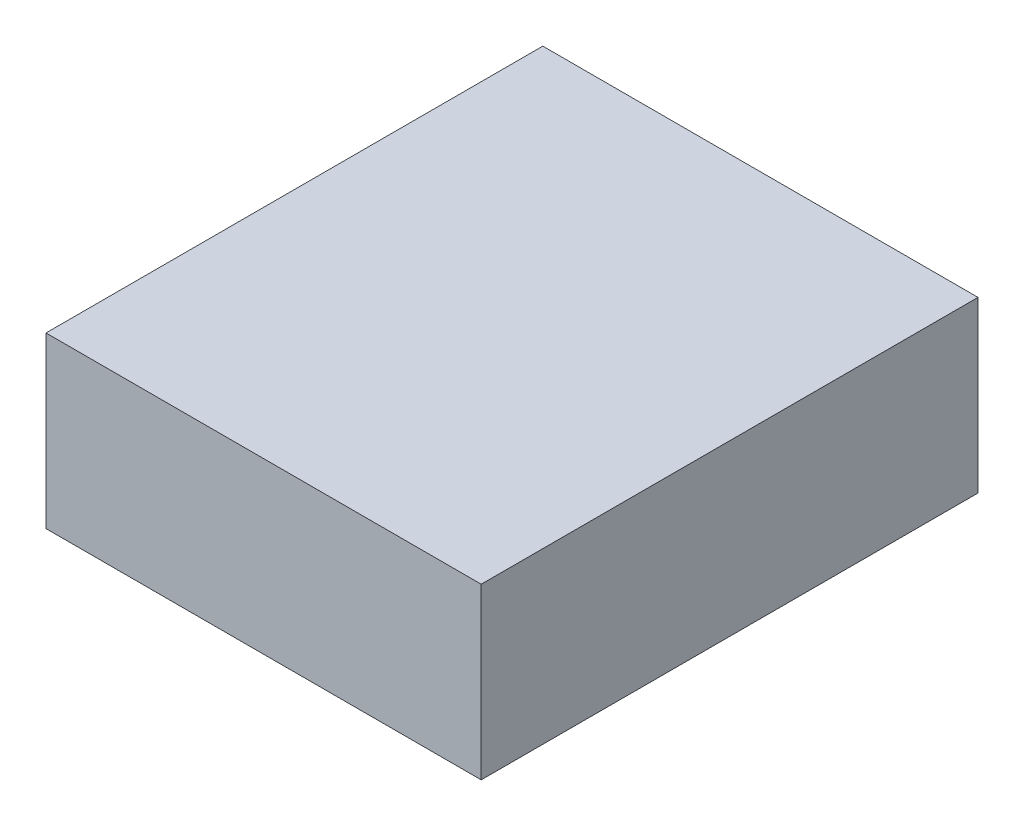
ISO-10303-21;
HEADER;
FILE_DESCRIPTION(('STEP AP214'),'2;1');
FILE_NAME('part.step','',(''),(''),'','','');
FILE_SCHEMA(('AUTOMOTIVE_DESIGN { 1 0 10303 214 1 1 1 1 }'));
ENDSEC;
DATA;
#1=APPLICATION_CONTEXT('core data for automotive mechanical design processes');
#2=APPLICATION_PROTOCOL_DEFINITION('international standard','automotive_design',2000,#1);
#3=PRODUCT_CONTEXT('',#1,'mechanical');
#4=PRODUCT('Part','Part','',(#3));
#5=PRODUCT_RELATED_PRODUCT_CATEGORY('part','',(#4));
#6=PRODUCT_DEFINITION_FORMATION('','',#4);
#7=PRODUCT_DEFINITION_CONTEXT('part definition',#1,'design');
#8=PRODUCT_DEFINITION('design','',#6,#7);
#9=PRODUCT_DEFINITION_SHAPE('','',#8);
#10=(LENGTH_UNIT() NAMED_UNIT(*) SI_UNIT(.MILLI.,.METRE.));
#11=(NAMED_UNIT(*) PLANE_ANGLE_UNIT() SI_UNIT($,.RADIAN.));
#12=(NAMED_UNIT(*) SI_UNIT($,.STERADIAN.) SOLID_ANGLE_UNIT());
#13=UNCERTAINTY_MEASURE_WITH_UNIT(LENGTH_MEASURE(1.E-05),#10,'distance_accuracy_value','');
#14=(GEOMETRIC_REPRESENTATION_CONTEXT(3) GLOBAL_UNCERTAINTY_ASSIGNED_CONTEXT((#13)) GLOBAL_UNIT_ASSIGNED_CONTEXT((#10,
#11,#12)) REPRESENTATION_CONTEXT('',''));
#15=CARTESIAN_POINT('',(0.,0.,0.));
#16=DIRECTION('',(0.,0.,1.));
#17=DIRECTION('',(1.,0.,0.));
#18=AXIS2_PLACEMENT_3D('',#15,#16,#17);
#19=CARTESIAN_POINT('',(-28.25,22.,32.25));
#20=DIRECTION('',(1.,0.,0.));
#21=DIRECTION('',(0.,0.,-1.));
#22=AXIS2_PLACEMENT_3D('',#19,#20,#21);
#23=PLANE('',#22);
#24=DIRECTION('',(0.,0.,1.));
#25=VECTOR('',#24,1.);
#26=CARTESIAN_POINT('',(-28.25,0.,32.25));
#27=LINE('',#26,#25);
#28=CARTESIAN_POINT('',(-28.25,0.,-32.25));
#29=VERTEX_POINT('',#28);
#30=CARTESIAN_POINT('',(-28.25,0.,32.25));
#31=VERTEX_POINT('',#30);
#32=EDGE_CURVE('E113',#29,#31,#27,.T.);
#33=ORIENTED_EDGE('',*,*,#32,.T.);
#34=DIRECTION('',(0.,-1.,0.));
#35=VECTOR('',#34,1.);
#36=CARTESIAN_POINT('',(-28.25,22.,32.25));
#37=LINE('',#36,#35);
#38=CARTESIAN_POINT('',(-28.25,22.,32.25));
#39=VERTEX_POINT('',#38);
#40=EDGE_CURVE('E11',#39,#31,#37,.T.);
#41=ORIENTED_EDGE('',*,*,#40,.F.);
#42=DIRECTION('',(0.,0.,1.));
#43=VECTOR('',#42,1.);
#44=CARTESIAN_POINT('',(-28.25,22.,32.25));
#45=LINE('',#44,#43);
#46=CARTESIAN_POINT('',(-28.25,22.,-32.25));
#47=VERTEX_POINT('',#46);
#48=EDGE_CURVE('E97',#47,#39,#45,.T.);
#49=ORIENTED_EDGE('',*,*,#48,.F.);
#50=DIRECTION('',(0.,-1.,0.));
#51=VECTOR('',#50,1.);
#52=CARTESIAN_POINT('',(-28.25,22.,-32.25));
#53=LINE('',#52,#51);
#54=EDGE_CURVE('E109',#47,#29,#53,.T.);
#55=ORIENTED_EDGE('',*,*,#54,.T.);
#56=EDGE_LOOP('',(#33,#41,#49,#55));
#57=FACE_BOUND('',#56,.T.);
#58=ADVANCED_FACE('F45',(#57),#23,.F.);
#59=CARTESIAN_POINT('',(28.25,22.,32.25));
#60=DIRECTION('',(0.,0.,-1.));
#61=DIRECTION('',(-1.,0.,0.));
#62=AXIS2_PLACEMENT_3D('',#59,#60,#61);
#63=PLANE('',#62);
#64=DIRECTION('',(1.,0.,0.));
#65=VECTOR('',#64,1.);
#66=CARTESIAN_POINT('',(28.25,0.,32.25));
#67=LINE('',#66,#65);
#68=CARTESIAN_POINT('',(28.25,0.,32.25));
#69=VERTEX_POINT('',#68);
#70=EDGE_CURVE('E102',#31,#69,#67,.T.);
#71=ORIENTED_EDGE('',*,*,#70,.T.);
#72=DIRECTION('',(0.,-1.,0.));
#73=VECTOR('',#72,1.);
#74=CARTESIAN_POINT('',(28.25,22.,32.25));
#75=LINE('',#74,#73);
#76=CARTESIAN_POINT('',(28.25,22.,32.25));
#77=VERTEX_POINT('',#76);
#78=EDGE_CURVE('E54',#77,#69,#75,.T.);
#79=ORIENTED_EDGE('',*,*,#78,.F.);
#80=DIRECTION('',(1.,0.,0.));
#81=VECTOR('',#80,1.);
#82=CARTESIAN_POINT('',(28.25,22.,32.25));
#83=LINE('',#82,#81);
#84=EDGE_CURVE('E92',#39,#77,#83,.T.);
#85=ORIENTED_EDGE('',*,*,#84,.F.);
#86=ORIENTED_EDGE('',*,*,#40,.T.);
#87=EDGE_LOOP('',(#71,#79,#85,#86));
#88=FACE_BOUND('',#87,.T.);
#89=ADVANCED_FACE('F101',(#88),#63,.F.);
#90=CARTESIAN_POINT('',(28.25,22.,32.25));
#91=DIRECTION('',(-1.,0.,0.));
#92=DIRECTION('',(0.,0.,1.));
#93=AXIS2_PLACEMENT_3D('',#90,#91,#92);
#94=PLANE('',#93);
#95=DIRECTION('',(0.,0.,-1.));
#96=VECTOR('',#95,1.);
#97=CARTESIAN_POINT('',(28.25,0.,32.25));
#98=LINE('',#97,#96);
#99=CARTESIAN_POINT('',(28.25,0.,-32.25));
#100=VERTEX_POINT('',#99);
#101=EDGE_CURVE('E79',#69,#100,#98,.T.);
#102=ORIENTED_EDGE('',*,*,#101,.T.);
#103=DIRECTION('',(0.,-1.,0.));
#104=VECTOR('',#103,1.);
#105=CARTESIAN_POINT('',(28.25,22.,-32.25));
#106=LINE('',#105,#104);
#107=CARTESIAN_POINT('',(28.25,22.,-32.25));
#108=VERTEX_POINT('',#107);
#109=EDGE_CURVE('E104',#108,#100,#106,.T.);
#110=ORIENTED_EDGE('',*,*,#109,.F.);
#111=DIRECTION('',(0.,0.,-1.));
#112=VECTOR('',#111,1.);
#113=CARTESIAN_POINT('',(28.25,22.,32.25));
#114=LINE('',#113,#112);
#115=EDGE_CURVE('E95',#77,#108,#114,.T.);
#116=ORIENTED_EDGE('',*,*,#115,.F.);
#117=ORIENTED_EDGE('',*,*,#78,.T.);
#118=EDGE_LOOP('',(#102,#110,#116,#117));
#119=FACE_BOUND('',#118,.T.);
#120=ADVANCED_FACE('F105',(#119),#94,.F.);
#121=CARTESIAN_POINT('',(28.25,22.,-32.25));
#122=DIRECTION('',(0.,0.,1.));
#123=DIRECTION('',(1.,0.,0.));
#124=AXIS2_PLACEMENT_3D('',#121,#122,#123);
#125=PLANE('',#124);
#126=DIRECTION('',(-1.,0.,0.));
#127=VECTOR('',#126,1.);
#128=CARTESIAN_POINT('',(28.25,0.,-32.25));
#129=LINE('',#128,#127);
#130=EDGE_CURVE('E85',#100,#29,#129,.T.);
#131=ORIENTED_EDGE('',*,*,#130,.T.);
#132=ORIENTED_EDGE('',*,*,#54,.F.);
#133=DIRECTION('',(-1.,0.,0.));
#134=VECTOR('',#133,1.);
#135=CARTESIAN_POINT('',(28.25,22.,-32.25));
#136=LINE('',#135,#134);
#137=EDGE_CURVE('E62',#108,#47,#136,.T.);
#138=ORIENTED_EDGE('',*,*,#137,.F.);
#139=ORIENTED_EDGE('',*,*,#109,.T.);
#140=EDGE_LOOP('',(#131,#132,#138,#139));
#141=FACE_BOUND('',#140,.T.);
#142=ADVANCED_FACE('F126',(#141),#125,.F.);
#143=CARTESIAN_POINT('',(0.,22.,0.));
#144=DIRECTION('',(0.,1.,0.));
#145=DIRECTION('',(0.,0.,1.));
#146=AXIS2_PLACEMENT_3D('',#143,#144,#145);
#147=PLANE('',#146);
#148=ORIENTED_EDGE('',*,*,#48,.T.);
#149=ORIENTED_EDGE('',*,*,#84,.T.);
#150=ORIENTED_EDGE('',*,*,#115,.T.);
#151=ORIENTED_EDGE('',*,*,#137,.T.);
#152=EDGE_LOOP('',(#148,#149,#150,#151));
#153=FACE_BOUND('',#152,.T.);
#154=ADVANCED_FACE('F93',(#153),#147,.T.);
#155=CARTESIAN_POINT('',(0.,0.,0.));
#156=DIRECTION('',(0.,1.,0.));
#157=DIRECTION('',(0.,0.,1.));
#158=AXIS2_PLACEMENT_3D('',#155,#156,#157);
#159=PLANE('',#158);
#160=ORIENTED_EDGE('',*,*,#32,.F.);
#161=ORIENTED_EDGE('',*,*,#130,.F.);
#162=ORIENTED_EDGE('',*,*,#101,.F.);
#163=ORIENTED_EDGE('',*,*,#70,.F.);
#164=EDGE_LOOP('',(#160,#161,#162,#163));
#165=FACE_BOUND('',#164,.T.);
#166=ADVANCED_FACE('F129',(#165),#159,.F.);
#167=CLOSED_SHELL('',(#58,#89,#120,#142,#154,#166));
#168=MANIFOLD_SOLID_BREP('B2',#167);
#169=ADVANCED_BREP_SHAPE_REPRESENTATION('',(#18,#168),#14);
#170=SHAPE_DEFINITION_REPRESENTATION(#9,#169);
ENDSEC;
END-ISO-10303-21;
